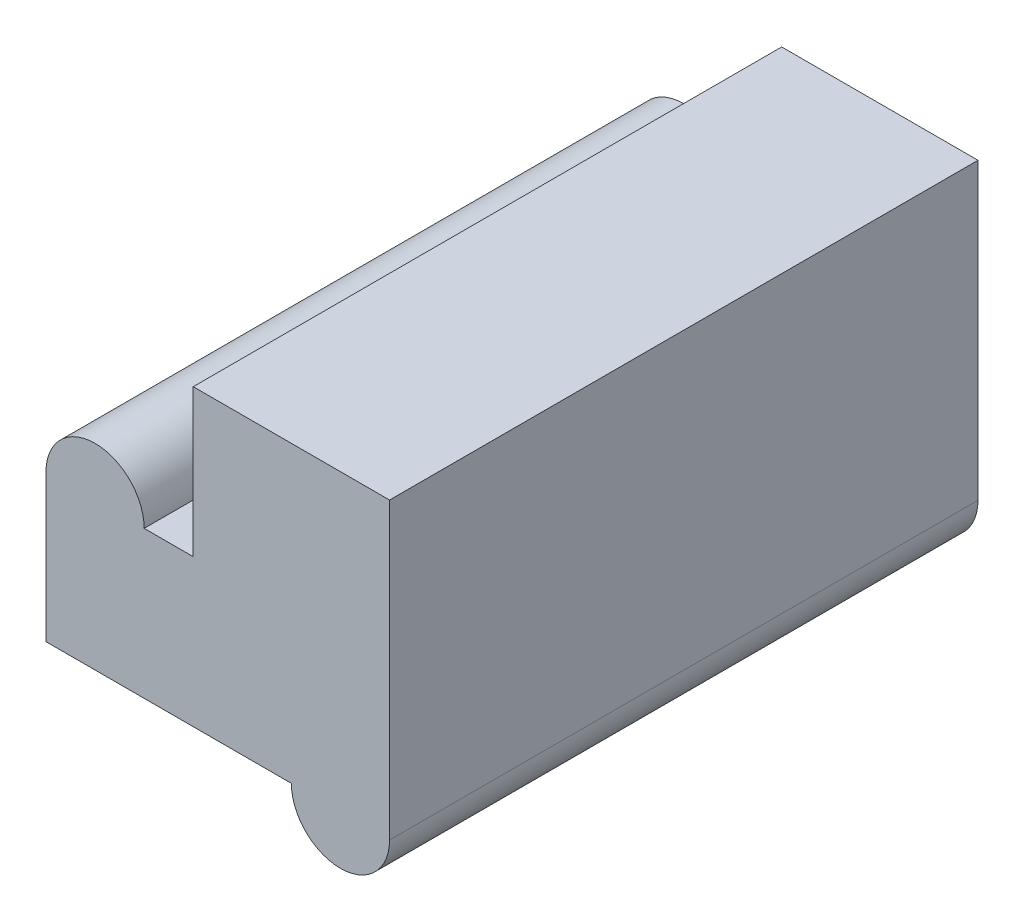
ISO-10303-21;
HEADER;
FILE_DESCRIPTION(('STEP AP214'),'2;1');
FILE_NAME('part.step','',(''),(''),'','','');
FILE_SCHEMA(('AUTOMOTIVE_DESIGN { 1 0 10303 214 1 1 1 1 }'));
ENDSEC;
DATA;
#1=APPLICATION_CONTEXT('core data for automotive mechanical design processes');
#2=APPLICATION_PROTOCOL_DEFINITION('international standard','automotive_design',2000,#1);
#3=PRODUCT_CONTEXT('',#1,'mechanical');
#4=PRODUCT('Part','Part','',(#3));
#5=PRODUCT_RELATED_PRODUCT_CATEGORY('part','',(#4));
#6=PRODUCT_DEFINITION_FORMATION('','',#4);
#7=PRODUCT_DEFINITION_CONTEXT('part definition',#1,'design');
#8=PRODUCT_DEFINITION('design','',#6,#7);
#9=PRODUCT_DEFINITION_SHAPE('','',#8);
#10=(LENGTH_UNIT() NAMED_UNIT(*) SI_UNIT(.MILLI.,.METRE.));
#11=(NAMED_UNIT(*) PLANE_ANGLE_UNIT() SI_UNIT($,.RADIAN.));
#12=(NAMED_UNIT(*) SI_UNIT($,.STERADIAN.) SOLID_ANGLE_UNIT());
#13=UNCERTAINTY_MEASURE_WITH_UNIT(LENGTH_MEASURE(1.E-05),#10,'distance_accuracy_value','');
#14=(GEOMETRIC_REPRESENTATION_CONTEXT(3) GLOBAL_UNCERTAINTY_ASSIGNED_CONTEXT((#13)) GLOBAL_UNIT_ASSIGNED_CONTEXT((#10,
#11,#12)) REPRESENTATION_CONTEXT('',''));
#15=CARTESIAN_POINT('',(0.,0.,0.));
#16=DIRECTION('',(0.,0.,1.));
#17=DIRECTION('',(1.,0.,0.));
#18=AXIS2_PLACEMENT_3D('',#15,#16,#17);
#19=CARTESIAN_POINT('',(-25.4,0.,-164.338));
#20=DIRECTION('',(0.,1.,0.));
#21=DIRECTION('',(-1.,0.,0.));
#22=AXIS2_PLACEMENT_3D('',#19,#20,#21);
#23=PLANE('',#22);
#24=DIRECTION('',(0.,0.,1.));
#25=VECTOR('',#24,1.);
#26=CARTESIAN_POINT('',(-25.4,0.,-164.338));
#27=LINE('',#26,#25);
#28=CARTESIAN_POINT('',(-25.4,0.,-164.338));
#29=VERTEX_POINT('',#28);
#30=CARTESIAN_POINT('',(-25.4,0.,140.208));
#31=VERTEX_POINT('',#30);
#32=EDGE_CURVE('E36',#29,#31,#27,.T.);
#33=ORIENTED_EDGE('',*,*,#32,.T.);
#34=DIRECTION('',(-1.,0.,0.));
#35=VECTOR('',#34,1.);
#36=CARTESIAN_POINT('',(-25.4,0.,140.208));
#37=LINE('',#36,#35);
#38=CARTESIAN_POINT('',(0.,0.,140.208));
#39=VERTEX_POINT('',#38);
#40=EDGE_CURVE('E97',#39,#31,#37,.T.);
#41=ORIENTED_EDGE('',*,*,#40,.F.);
#42=DIRECTION('',(0.,0.,1.));
#43=VECTOR('',#42,1.);
#44=CARTESIAN_POINT('',(0.,0.,-164.338));
#45=LINE('',#44,#43);
#46=CARTESIAN_POINT('',(0.,0.,-164.338));
#47=VERTEX_POINT('',#46);
#48=EDGE_CURVE('E11',#47,#39,#45,.T.);
#49=ORIENTED_EDGE('',*,*,#48,.F.);
#50=DIRECTION('',(-1.,0.,0.));
#51=VECTOR('',#50,1.);
#52=CARTESIAN_POINT('',(-25.4,0.,-164.338));
#53=LINE('',#52,#51);
#54=EDGE_CURVE('E98',#47,#29,#53,.T.);
#55=ORIENTED_EDGE('',*,*,#54,.T.);
#56=EDGE_LOOP('',(#33,#41,#49,#55));
#57=FACE_BOUND('',#56,.T.);
#58=ADVANCED_FACE('F33',(#57),#23,.T.);
#59=CARTESIAN_POINT('',(0.,0.,-164.338));
#60=DIRECTION('',(-1.,0.,0.));
#61=DIRECTION('',(0.,0.,1.));
#62=AXIS2_PLACEMENT_3D('',#59,#60,#61);
#63=PLANE('',#62);
#64=ORIENTED_EDGE('',*,*,#48,.T.);
#65=DIRECTION('',(0.,-1.,0.));
#66=VECTOR('',#65,1.);
#67=CARTESIAN_POINT('',(0.,0.,140.208));
#68=LINE('',#67,#66);
#69=CARTESIAN_POINT('',(0.,76.2,140.208));
#70=VERTEX_POINT('',#69);
#71=EDGE_CURVE('E115',#70,#39,#68,.T.);
#72=ORIENTED_EDGE('',*,*,#71,.F.);
#73=DIRECTION('',(0.,0.,1.));
#74=VECTOR('',#73,1.);
#75=CARTESIAN_POINT('',(0.,76.2,-164.338));
#76=LINE('',#75,#74);
#77=CARTESIAN_POINT('',(0.,76.2,-164.338));
#78=VERTEX_POINT('',#77);
#79=EDGE_CURVE('E41',#78,#70,#76,.T.);
#80=ORIENTED_EDGE('',*,*,#79,.F.);
#81=DIRECTION('',(0.,-1.,0.));
#82=VECTOR('',#81,1.);
#83=CARTESIAN_POINT('',(0.,0.,-164.338));
#84=LINE('',#83,#82);
#85=EDGE_CURVE('E103',#78,#47,#84,.T.);
#86=ORIENTED_EDGE('',*,*,#85,.T.);
#87=EDGE_LOOP('',(#64,#72,#80,#86));
#88=FACE_BOUND('',#87,.T.);
#89=ADVANCED_FACE('F179',(#88),#63,.T.);
#90=CARTESIAN_POINT('',(0.,76.2,-164.338));
#91=DIRECTION('',(0.,1.,0.));
#92=DIRECTION('',(0.,0.,1.));
#93=AXIS2_PLACEMENT_3D('',#90,#91,#92);
#94=PLANE('',#93);
#95=ORIENTED_EDGE('',*,*,#79,.T.);
#96=DIRECTION('',(-1.,0.,0.));
#97=VECTOR('',#96,1.);
#98=CARTESIAN_POINT('',(0.,76.2,140.208));
#99=LINE('',#98,#97);
#100=CARTESIAN_POINT('',(101.6,76.2,140.208));
#101=VERTEX_POINT('',#100);
#102=EDGE_CURVE('E128',#101,#70,#99,.T.);
#103=ORIENTED_EDGE('',*,*,#102,.F.);
#104=DIRECTION('',(0.,0.,1.));
#105=VECTOR('',#104,1.);
#106=CARTESIAN_POINT('',(101.6,76.2,-164.338));
#107=LINE('',#106,#105);
#108=CARTESIAN_POINT('',(101.6,76.2,-164.338));
#109=VERTEX_POINT('',#108);
#110=EDGE_CURVE('E150',#109,#101,#107,.T.);
#111=ORIENTED_EDGE('',*,*,#110,.F.);
#112=DIRECTION('',(-1.,0.,0.));
#113=VECTOR('',#112,1.);
#114=CARTESIAN_POINT('',(0.,76.2,-164.338));
#115=LINE('',#114,#113);
#116=EDGE_CURVE('E146',#109,#78,#115,.T.);
#117=ORIENTED_EDGE('',*,*,#116,.T.);
#118=EDGE_LOOP('',(#95,#103,#111,#117));
#119=FACE_BOUND('',#118,.T.);
#120=ADVANCED_FACE('F178',(#119),#94,.T.);
#121=CARTESIAN_POINT('',(101.6,76.2,-164.338));
#122=DIRECTION('',(1.,0.,0.));
#123=DIRECTION('',(0.,1.,0.));
#124=AXIS2_PLACEMENT_3D('',#121,#122,#123);
#125=PLANE('',#124);
#126=ORIENTED_EDGE('',*,*,#110,.T.);
#127=DIRECTION('',(0.,1.,0.));
#128=VECTOR('',#127,1.);
#129=CARTESIAN_POINT('',(101.6,76.2,140.208));
#130=LINE('',#129,#128);
#131=CARTESIAN_POINT('',(101.6,-76.2,140.208));
#132=VERTEX_POINT('',#131);
#133=EDGE_CURVE('E125',#132,#101,#130,.T.);
#134=ORIENTED_EDGE('',*,*,#133,.F.);
#135=DIRECTION('',(0.,0.,1.));
#136=VECTOR('',#135,1.);
#137=CARTESIAN_POINT('',(101.6,-76.2,-164.338));
#138=LINE('',#137,#136);
#139=CARTESIAN_POINT('',(101.6,-76.2,-164.338));
#140=VERTEX_POINT('',#139);
#141=EDGE_CURVE('E152',#140,#132,#138,.T.);
#142=ORIENTED_EDGE('',*,*,#141,.F.);
#143=DIRECTION('',(0.,1.,0.));
#144=VECTOR('',#143,1.);
#145=CARTESIAN_POINT('',(101.6,76.2,-164.338));
#146=LINE('',#145,#144);
#147=EDGE_CURVE('E143',#140,#109,#146,.T.);
#148=ORIENTED_EDGE('',*,*,#147,.T.);
#149=EDGE_LOOP('',(#126,#134,#142,#148));
#150=FACE_BOUND('',#149,.T.);
#151=ADVANCED_FACE('F174',(#150),#125,.T.);
#152=CARTESIAN_POINT('',(76.2,-76.2,-164.338));
#153=DIRECTION('',(0.,0.,1.));
#154=DIRECTION('',(1.,0.,0.));
#155=AXIS2_PLACEMENT_3D('',#152,#153,#154);
#156=CYLINDRICAL_SURFACE('',#155,25.4);
#157=ORIENTED_EDGE('',*,*,#141,.T.);
#158=CARTESIAN_POINT('',(76.2,-76.2,140.208));
#159=DIRECTION('',(0.,0.,1.));
#160=DIRECTION('',(-1.,0.,0.));
#161=AXIS2_PLACEMENT_3D('',#158,#159,#160);
#162=CIRCLE('',#161,25.4);
#163=CARTESIAN_POINT('',(50.8,-76.2,140.208));
#164=VERTEX_POINT('',#163);
#165=EDGE_CURVE('E122',#164,#132,#162,.T.);
#166=ORIENTED_EDGE('',*,*,#165,.F.);
#167=DIRECTION('',(0.,0.,1.));
#168=VECTOR('',#167,1.);
#169=CARTESIAN_POINT('',(50.8,-76.2,-164.338));
#170=LINE('',#169,#168);
#171=CARTESIAN_POINT('',(50.8,-76.2,-164.338));
#172=VERTEX_POINT('',#171);
#173=EDGE_CURVE('E154',#172,#164,#170,.T.);
#174=ORIENTED_EDGE('',*,*,#173,.F.);
#175=CARTESIAN_POINT('',(76.2,-76.2,-164.338));
#176=DIRECTION('',(0.,0.,1.));
#177=DIRECTION('',(-1.,0.,0.));
#178=AXIS2_PLACEMENT_3D('',#175,#176,#177);
#179=CIRCLE('',#178,25.4);
#180=EDGE_CURVE('E140',#172,#140,#179,.T.);
#181=ORIENTED_EDGE('',*,*,#180,.T.);
#182=EDGE_LOOP('',(#157,#166,#174,#181));
#183=FACE_BOUND('',#182,.T.);
#184=ADVANCED_FACE('F167',(#183),#156,.T.);
#185=CARTESIAN_POINT('',(50.8,-76.2,-164.338));
#186=DIRECTION('',(0.,-1.,0.));
#187=DIRECTION('',(1.,0.,0.));
#188=AXIS2_PLACEMENT_3D('',#185,#186,#187);
#189=PLANE('',#188);
#190=ORIENTED_EDGE('',*,*,#173,.T.);
#191=DIRECTION('',(1.,0.,0.));
#192=VECTOR('',#191,1.);
#193=CARTESIAN_POINT('',(50.8,-76.2,140.208));
#194=LINE('',#193,#192);
#195=CARTESIAN_POINT('',(-76.2,-76.2,140.208));
#196=VERTEX_POINT('',#195);
#197=EDGE_CURVE('E119',#196,#164,#194,.T.);
#198=ORIENTED_EDGE('',*,*,#197,.F.);
#199=DIRECTION('',(0.,0.,1.));
#200=VECTOR('',#199,1.);
#201=CARTESIAN_POINT('',(-76.2,-76.2,-164.338));
#202=LINE('',#201,#200);
#203=CARTESIAN_POINT('',(-76.2,-76.2,-164.338));
#204=VERTEX_POINT('',#203);
#205=EDGE_CURVE('E156',#204,#196,#202,.T.);
#206=ORIENTED_EDGE('',*,*,#205,.F.);
#207=DIRECTION('',(1.,0.,0.));
#208=VECTOR('',#207,1.);
#209=CARTESIAN_POINT('',(50.8,-76.2,-164.338));
#210=LINE('',#209,#208);
#211=EDGE_CURVE('E137',#204,#172,#210,.T.);
#212=ORIENTED_EDGE('',*,*,#211,.T.);
#213=EDGE_LOOP('',(#190,#198,#206,#212));
#214=FACE_BOUND('',#213,.T.);
#215=ADVANCED_FACE('F164',(#214),#189,.T.);
#216=CARTESIAN_POINT('',(-76.2,-76.2,-164.338));
#217=DIRECTION('',(-1.,0.,0.));
#218=DIRECTION('',(0.,0.,1.));
#219=AXIS2_PLACEMENT_3D('',#216,#217,#218);
#220=PLANE('',#219);
#221=ORIENTED_EDGE('',*,*,#205,.T.);
#222=DIRECTION('',(0.,-1.,0.));
#223=VECTOR('',#222,1.);
#224=CARTESIAN_POINT('',(-76.2,-76.2,140.208));
#225=LINE('',#224,#223);
#226=CARTESIAN_POINT('',(-76.2,0.,140.208));
#227=VERTEX_POINT('',#226);
#228=EDGE_CURVE('E110',#227,#196,#225,.T.);
#229=ORIENTED_EDGE('',*,*,#228,.F.);
#230=DIRECTION('',(0.,0.,1.));
#231=VECTOR('',#230,1.);
#232=CARTESIAN_POINT('',(-76.2,0.,-164.338));
#233=LINE('',#232,#231);
#234=CARTESIAN_POINT('',(-76.2,0.,-164.338));
#235=VERTEX_POINT('',#234);
#236=EDGE_CURVE('E102',#235,#227,#233,.T.);
#237=ORIENTED_EDGE('',*,*,#236,.F.);
#238=DIRECTION('',(0.,-1.,0.));
#239=VECTOR('',#238,1.);
#240=CARTESIAN_POINT('',(-76.2,-76.2,-164.338));
#241=LINE('',#240,#239);
#242=EDGE_CURVE('E134',#235,#204,#241,.T.);
#243=ORIENTED_EDGE('',*,*,#242,.T.);
#244=EDGE_LOOP('',(#221,#229,#237,#243));
#245=FACE_BOUND('',#244,.T.);
#246=ADVANCED_FACE('F158',(#245),#220,.T.);
#247=CARTESIAN_POINT('',(-50.8,0.,-164.338));
#248=DIRECTION('',(0.,0.,1.));
#249=DIRECTION('',(1.,0.,0.));
#250=AXIS2_PLACEMENT_3D('',#247,#248,#249);
#251=CYLINDRICAL_SURFACE('',#250,25.4);
#252=ORIENTED_EDGE('',*,*,#236,.T.);
#253=CARTESIAN_POINT('',(-50.8,0.,140.208));
#254=DIRECTION('',(0.,0.,1.));
#255=DIRECTION('',(-1.,0.,0.));
#256=AXIS2_PLACEMENT_3D('',#253,#254,#255);
#257=CIRCLE('',#256,25.4);
#258=EDGE_CURVE('E105',#31,#227,#257,.T.);
#259=ORIENTED_EDGE('',*,*,#258,.F.);
#260=ORIENTED_EDGE('',*,*,#32,.F.);
#261=CARTESIAN_POINT('',(-50.8,0.,-164.338));
#262=DIRECTION('',(0.,0.,1.));
#263=DIRECTION('',(-1.,0.,0.));
#264=AXIS2_PLACEMENT_3D('',#261,#262,#263);
#265=CIRCLE('',#264,25.4);
#266=EDGE_CURVE('E132',#29,#235,#265,.T.);
#267=ORIENTED_EDGE('',*,*,#266,.T.);
#268=EDGE_LOOP('',(#252,#259,#260,#267));
#269=FACE_BOUND('',#268,.T.);
#270=ADVANCED_FACE('F106',(#269),#251,.T.);
#271=CARTESIAN_POINT('',(76.2,-76.2,-164.338));
#272=DIRECTION('',(0.,0.,-1.));
#273=DIRECTION('',(-1.,0.,0.));
#274=AXIS2_PLACEMENT_3D('',#271,#272,#273);
#275=PLANE('',#274);
#276=ORIENTED_EDGE('',*,*,#54,.F.);
#277=ORIENTED_EDGE('',*,*,#85,.F.);
#278=ORIENTED_EDGE('',*,*,#116,.F.);
#279=ORIENTED_EDGE('',*,*,#147,.F.);
#280=ORIENTED_EDGE('',*,*,#180,.F.);
#281=ORIENTED_EDGE('',*,*,#211,.F.);
#282=ORIENTED_EDGE('',*,*,#242,.F.);
#283=ORIENTED_EDGE('',*,*,#266,.F.);
#284=EDGE_LOOP('',(#276,#277,#278,#279,#280,#281,#282,#283));
#285=FACE_BOUND('',#284,.T.);
#286=ADVANCED_FACE('F170',(#285),#275,.T.);
#287=CARTESIAN_POINT('',(76.2,-76.2,140.208));
#288=DIRECTION('',(0.,0.,-1.));
#289=DIRECTION('',(-1.,0.,0.));
#290=AXIS2_PLACEMENT_3D('',#287,#288,#289);
#291=PLANE('',#290);
#292=ORIENTED_EDGE('',*,*,#40,.T.);
#293=ORIENTED_EDGE('',*,*,#258,.T.);
#294=ORIENTED_EDGE('',*,*,#228,.T.);
#295=ORIENTED_EDGE('',*,*,#197,.T.);
#296=ORIENTED_EDGE('',*,*,#165,.T.);
#297=ORIENTED_EDGE('',*,*,#133,.T.);
#298=ORIENTED_EDGE('',*,*,#102,.T.);
#299=ORIENTED_EDGE('',*,*,#71,.T.);
#300=EDGE_LOOP('',(#292,#293,#294,#295,#296,#297,#298,#299));
#301=FACE_BOUND('',#300,.T.);
#302=ADVANCED_FACE('F113',(#301),#291,.F.);
#303=CLOSED_SHELL('',(#58,#89,#120,#151,#184,#215,#246,#270,#286,#302));
#304=MANIFOLD_SOLID_BREP('B2',#303);
#305=ADVANCED_BREP_SHAPE_REPRESENTATION('',(#18,#304),#14);
#306=SHAPE_DEFINITION_REPRESENTATION(#9,#305);
ENDSEC;
END-ISO-10303-21;
